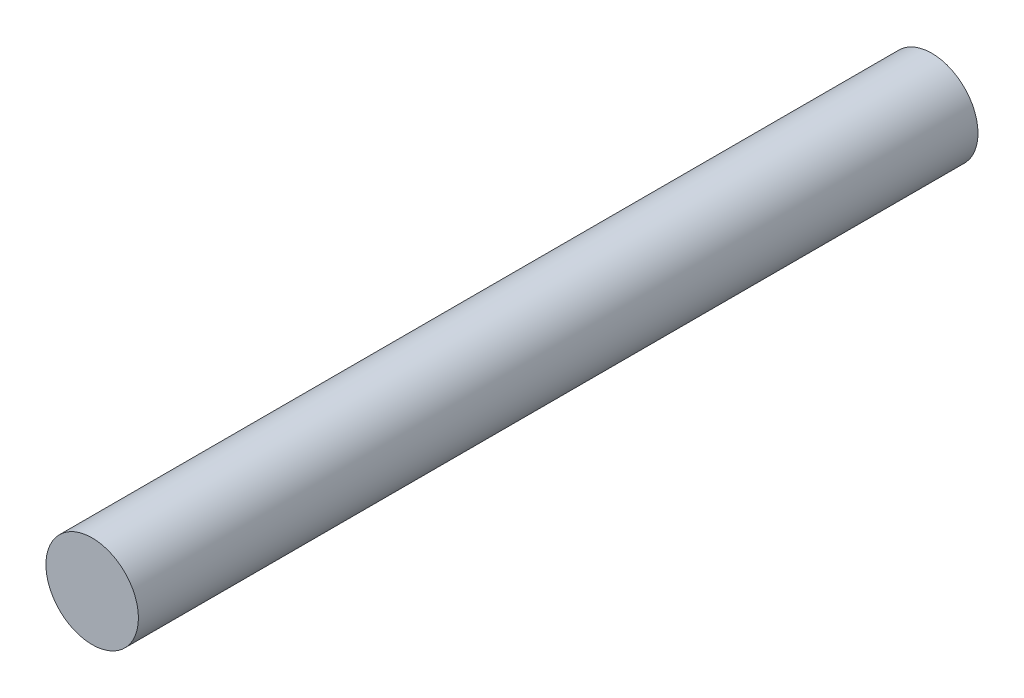
ISO-10303-21;
HEADER;
FILE_DESCRIPTION(('STEP AP214'),'2;1');
FILE_NAME('part.step','',(''),(''),'','','');
FILE_SCHEMA(('AUTOMOTIVE_DESIGN { 1 0 10303 214 1 1 1 1 }'));
ENDSEC;
DATA;
#1=APPLICATION_CONTEXT('core data for automotive mechanical design processes');
#2=APPLICATION_PROTOCOL_DEFINITION('international standard','automotive_design',2000,#1);
#3=PRODUCT_CONTEXT('',#1,'mechanical');
#4=PRODUCT('Part','Part','',(#3));
#5=PRODUCT_RELATED_PRODUCT_CATEGORY('part','',(#4));
#6=PRODUCT_DEFINITION_FORMATION('','',#4);
#7=PRODUCT_DEFINITION_CONTEXT('part definition',#1,'design');
#8=PRODUCT_DEFINITION('design','',#6,#7);
#9=PRODUCT_DEFINITION_SHAPE('','',#8);
#10=(LENGTH_UNIT() NAMED_UNIT(*) SI_UNIT(.MILLI.,.METRE.));
#11=(NAMED_UNIT(*) PLANE_ANGLE_UNIT() SI_UNIT($,.RADIAN.));
#12=(NAMED_UNIT(*) SI_UNIT($,.STERADIAN.) SOLID_ANGLE_UNIT());
#13=UNCERTAINTY_MEASURE_WITH_UNIT(LENGTH_MEASURE(1.E-05),#10,'distance_accuracy_value','');
#14=(GEOMETRIC_REPRESENTATION_CONTEXT(3) GLOBAL_UNCERTAINTY_ASSIGNED_CONTEXT((#13)) GLOBAL_UNIT_ASSIGNED_CONTEXT((#10,
#11,#12)) REPRESENTATION_CONTEXT('',''));
#15=CARTESIAN_POINT('',(0.,0.,0.));
#16=DIRECTION('',(0.,0.,1.));
#17=DIRECTION('',(1.,0.,0.));
#18=AXIS2_PLACEMENT_3D('',#15,#16,#17);
#19=CARTESIAN_POINT('',(0.,0.,0.));
#20=DIRECTION('',(0.,0.,1.));
#21=DIRECTION('',(1.,0.,0.));
#22=AXIS2_PLACEMENT_3D('',#19,#20,#21);
#23=PLANE('',#22);
#24=CARTESIAN_POINT('',(0.,0.,0.));
#25=DIRECTION('',(0.,0.,1.));
#26=DIRECTION('',(1.,0.,0.));
#27=AXIS2_PLACEMENT_3D('',#24,#25,#26);
#28=CIRCLE('',#27,1.);
#29=CARTESIAN_POINT('',(1.,0.,0.));
#30=VERTEX_POINT('',#29);
#31=EDGE_CURVE('E10',#30,#30,#28,.T.);
#32=ORIENTED_EDGE('',*,*,#31,.F.);
#33=EDGE_LOOP('',(#32));
#34=FACE_BOUND('',#33,.T.);
#35=ADVANCED_FACE('F15',(#34),#23,.F.);
#36=CARTESIAN_POINT('',(0.,0.,18.15));
#37=DIRECTION('',(0.,0.,1.));
#38=DIRECTION('',(1.,0.,0.));
#39=AXIS2_PLACEMENT_3D('',#36,#37,#38);
#40=PLANE('',#39);
#41=CARTESIAN_POINT('',(0.,0.,18.15));
#42=DIRECTION('',(0.,0.,1.));
#43=DIRECTION('',(1.,0.,0.));
#44=AXIS2_PLACEMENT_3D('',#41,#42,#43);
#45=CIRCLE('',#44,1.);
#46=CARTESIAN_POINT('',(1.,0.,18.15));
#47=VERTEX_POINT('',#46);
#48=EDGE_CURVE('E22',#47,#47,#45,.T.);
#49=ORIENTED_EDGE('',*,*,#48,.T.);
#50=EDGE_LOOP('',(#49));
#51=FACE_BOUND('',#50,.T.);
#52=ADVANCED_FACE('F35',(#51),#40,.T.);
#53=CARTESIAN_POINT('',(0.,0.,18.15));
#54=DIRECTION('',(0.,0.,-1.));
#55=DIRECTION('',(-1.,0.,0.));
#56=AXIS2_PLACEMENT_3D('',#53,#54,#55);
#57=CYLINDRICAL_SURFACE('',#56,1.);
#58=ORIENTED_EDGE('',*,*,#31,.T.);
#59=EDGE_LOOP('',(#58));
#60=FACE_BOUND('',#59,.T.);
#61=ORIENTED_EDGE('',*,*,#48,.F.);
#62=EDGE_LOOP('',(#61));
#63=FACE_BOUND('',#62,.T.);
#64=ADVANCED_FACE('F37',(#60,#63),#57,.T.);
#65=CLOSED_SHELL('',(#35,#52,#64));
#66=MANIFOLD_SOLID_BREP('B1',#65);
#67=ADVANCED_BREP_SHAPE_REPRESENTATION('',(#18,#66),#14);
#68=SHAPE_DEFINITION_REPRESENTATION(#9,#67);
ENDSEC;
END-ISO-10303-21;
